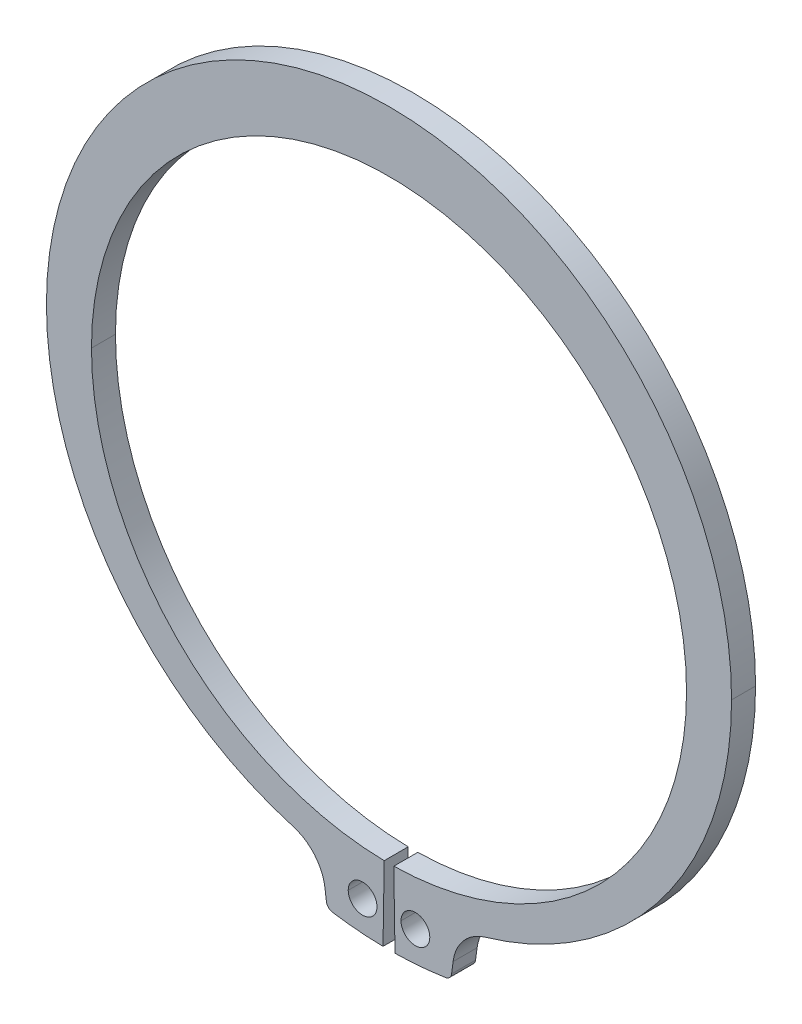
ISO-10303-21;
HEADER;
FILE_DESCRIPTION(('STEP AP214'),'2;1');
FILE_NAME('part.step','',(''),(''),'','','');
FILE_SCHEMA(('AUTOMOTIVE_DESIGN { 1 0 10303 214 1 1 1 1 }'));
ENDSEC;
DATA;
#1=APPLICATION_CONTEXT('core data for automotive mechanical design processes');
#2=APPLICATION_PROTOCOL_DEFINITION('international standard','automotive_design',2000,#1);
#3=PRODUCT_CONTEXT('',#1,'mechanical');
#4=PRODUCT('Part','Part','',(#3));
#5=PRODUCT_RELATED_PRODUCT_CATEGORY('part','',(#4));
#6=PRODUCT_DEFINITION_FORMATION('','',#4);
#7=PRODUCT_DEFINITION_CONTEXT('part definition',#1,'design');
#8=PRODUCT_DEFINITION('design','',#6,#7);
#9=PRODUCT_DEFINITION_SHAPE('','',#8);
#10=(LENGTH_UNIT() NAMED_UNIT(*) SI_UNIT(.MILLI.,.METRE.));
#11=(NAMED_UNIT(*) PLANE_ANGLE_UNIT() SI_UNIT($,.RADIAN.));
#12=(NAMED_UNIT(*) SI_UNIT($,.STERADIAN.) SOLID_ANGLE_UNIT());
#13=UNCERTAINTY_MEASURE_WITH_UNIT(LENGTH_MEASURE(1.E-05),#10,'distance_accuracy_value','');
#14=(GEOMETRIC_REPRESENTATION_CONTEXT(3) GLOBAL_UNCERTAINTY_ASSIGNED_CONTEXT((#13)) GLOBAL_UNIT_ASSIGNED_CONTEXT((#10,
#11,#12)) REPRESENTATION_CONTEXT('',''));
#15=CARTESIAN_POINT('',(0.,0.,0.));
#16=DIRECTION('',(0.,0.,1.));
#17=DIRECTION('',(1.,0.,0.));
#18=AXIS2_PLACEMENT_3D('',#15,#16,#17);
#19=CARTESIAN_POINT('',(-2.75,-35.5437758264369,-2.5));
#20=DIRECTION('',(0.,0.,1.));
#21=DIRECTION('',(1.,0.,0.));
#22=AXIS2_PLACEMENT_3D('',#19,#20,#21);
#23=CYLINDRICAL_SURFACE('',#22,1.5);
#24=DIRECTION('',(0.,0.,1.));
#25=VECTOR('',#24,1.);
#26=CARTESIAN_POINT('',(-4.25,-35.5437758264369,-2.5));
#27=LINE('',#26,#25);
#28=CARTESIAN_POINT('',(-4.25,-35.5437758264369,-2.5));
#29=VERTEX_POINT('',#28);
#30=CARTESIAN_POINT('',(-4.25,-35.5437758264369,0.));
#31=VERTEX_POINT('',#30);
#32=EDGE_CURVE('E211',#29,#31,#27,.T.);
#33=ORIENTED_EDGE('',*,*,#32,.F.);
#34=CARTESIAN_POINT('',(-2.75,-35.5437758264369,-2.5));
#35=DIRECTION('',(0.,0.,1.));
#36=DIRECTION('',(1.,0.,0.));
#37=AXIS2_PLACEMENT_3D('',#34,#35,#36);
#38=CIRCLE('',#37,1.5);
#39=CARTESIAN_POINT('',(-1.25,-35.5437758264369,-2.5));
#40=VERTEX_POINT('',#39);
#41=EDGE_CURVE('E206',#40,#29,#38,.T.);
#42=ORIENTED_EDGE('',*,*,#41,.F.);
#43=DIRECTION('',(0.,0.,1.));
#44=VECTOR('',#43,1.);
#45=CARTESIAN_POINT('',(-1.25,-35.5437758264369,-2.5));
#46=LINE('',#45,#44);
#47=CARTESIAN_POINT('',(-1.25,-35.5437758264369,0.));
#48=VERTEX_POINT('',#47);
#49=EDGE_CURVE('E208',#40,#48,#46,.T.);
#50=ORIENTED_EDGE('',*,*,#49,.T.);
#51=CARTESIAN_POINT('',(-2.75,-35.5437758264369,0.));
#52=DIRECTION('',(0.,0.,1.));
#53=DIRECTION('',(1.,0.,0.));
#54=AXIS2_PLACEMENT_3D('',#51,#52,#53);
#55=CIRCLE('',#54,1.5);
#56=EDGE_CURVE('E26',#48,#31,#55,.T.);
#57=ORIENTED_EDGE('',*,*,#56,.T.);
#58=EDGE_LOOP('',(#33,#42,#50,#57));
#59=FACE_BOUND('',#58,.T.);
#60=ADVANCED_FACE('F16',(#59),#23,.F.);
#61=CARTESIAN_POINT('',(2.75,-35.5437758264369,-2.5));
#62=DIRECTION('',(0.,0.,1.));
#63=DIRECTION('',(1.,0.,0.));
#64=AXIS2_PLACEMENT_3D('',#61,#62,#63);
#65=CYLINDRICAL_SURFACE('',#64,1.5);
#66=DIRECTION('',(0.,0.,1.));
#67=VECTOR('',#66,1.);
#68=CARTESIAN_POINT('',(1.25,-35.5437758264369,-2.5));
#69=LINE('',#68,#67);
#70=CARTESIAN_POINT('',(1.25,-35.5437758264369,-2.5));
#71=VERTEX_POINT('',#70);
#72=CARTESIAN_POINT('',(1.25,-35.5437758264369,0.));
#73=VERTEX_POINT('',#72);
#74=EDGE_CURVE('E256',#71,#73,#69,.T.);
#75=ORIENTED_EDGE('',*,*,#74,.F.);
#76=CARTESIAN_POINT('',(2.75,-35.5437758264369,-2.5));
#77=DIRECTION('',(0.,0.,1.));
#78=DIRECTION('',(1.,0.,0.));
#79=AXIS2_PLACEMENT_3D('',#76,#77,#78);
#80=CIRCLE('',#79,1.5);
#81=CARTESIAN_POINT('',(4.25,-35.5437758264369,-2.5));
#82=VERTEX_POINT('',#81);
#83=EDGE_CURVE('E144',#82,#71,#80,.T.);
#84=ORIENTED_EDGE('',*,*,#83,.F.);
#85=DIRECTION('',(0.,0.,1.));
#86=VECTOR('',#85,1.);
#87=CARTESIAN_POINT('',(4.25,-35.5437758264369,-2.5));
#88=LINE('',#87,#86);
#89=CARTESIAN_POINT('',(4.25,-35.5437758264369,0.));
#90=VERTEX_POINT('',#89);
#91=EDGE_CURVE('E314',#82,#90,#88,.T.);
#92=ORIENTED_EDGE('',*,*,#91,.T.);
#93=CARTESIAN_POINT('',(2.75,-35.5437758264369,0.));
#94=DIRECTION('',(0.,0.,1.));
#95=DIRECTION('',(1.,0.,0.));
#96=AXIS2_PLACEMENT_3D('',#93,#94,#95);
#97=CIRCLE('',#96,1.5);
#98=EDGE_CURVE('E11',#90,#73,#97,.T.);
#99=ORIENTED_EDGE('',*,*,#98,.T.);
#100=EDGE_LOOP('',(#75,#84,#92,#99));
#101=FACE_BOUND('',#100,.T.);
#102=ADVANCED_FACE('F449',(#101),#65,.F.);
#103=CARTESIAN_POINT('',(0.,0.,0.));
#104=DIRECTION('',(0.,0.,1.));
#105=DIRECTION('',(1.,0.,0.));
#106=AXIS2_PLACEMENT_3D('',#103,#104,#105);
#107=PLANE('',#106);
#108=ORIENTED_EDGE('',*,*,#98,.F.);
#109=CARTESIAN_POINT('',(2.75,-35.5437758264369,0.));
#110=DIRECTION('',(0.,0.,1.));
#111=DIRECTION('',(1.,0.,0.));
#112=AXIS2_PLACEMENT_3D('',#109,#110,#111);
#113=CIRCLE('',#112,1.5);
#114=EDGE_CURVE('E260',#73,#90,#113,.T.);
#115=ORIENTED_EDGE('',*,*,#114,.F.);
#116=EDGE_LOOP('',(#108,#115));
#117=FACE_BOUND('',#116,.T.);
#118=ORIENTED_EDGE('',*,*,#56,.F.);
#119=CARTESIAN_POINT('',(-2.75,-35.5437758264369,0.));
#120=DIRECTION('',(0.,0.,1.));
#121=DIRECTION('',(1.,0.,0.));
#122=AXIS2_PLACEMENT_3D('',#119,#120,#121);
#123=CIRCLE('',#122,1.5);
#124=EDGE_CURVE('E220',#31,#48,#123,.T.);
#125=ORIENTED_EDGE('',*,*,#124,.F.);
#126=EDGE_LOOP('',(#118,#125));
#127=FACE_BOUND('',#126,.T.);
#128=CARTESIAN_POINT('',(0.,0.,0.));
#129=DIRECTION('',(0.,0.,-1.));
#130=DIRECTION('',(1.,0.,0.));
#131=AXIS2_PLACEMENT_3D('',#128,#129,#130);
#132=CIRCLE('',#131,31.);
#133=CARTESIAN_POINT('',(-0.499355670103093,-30.9959778667287,0.));
#134=VERTEX_POINT('',#133);
#135=CARTESIAN_POINT('',(-31.,0.,0.));
#136=VERTEX_POINT('',#135);
#137=EDGE_CURVE('E283',#134,#136,#132,.T.);
#138=ORIENTED_EDGE('',*,*,#137,.T.);
#139=CARTESIAN_POINT('',(0.,0.,0.));
#140=DIRECTION('',(0.,0.,-1.));
#141=DIRECTION('',(1.,0.,0.));
#142=AXIS2_PLACEMENT_3D('',#139,#140,#141);
#143=CIRCLE('',#142,31.);
#144=CARTESIAN_POINT('',(31.,0.,0.));
#145=VERTEX_POINT('',#144);
#146=EDGE_CURVE('E382',#136,#145,#143,.T.);
#147=ORIENTED_EDGE('',*,*,#146,.T.);
#148=CARTESIAN_POINT('',(0.,0.,0.));
#149=DIRECTION('',(0.,0.,-1.));
#150=DIRECTION('',(1.,0.,0.));
#151=AXIS2_PLACEMENT_3D('',#148,#149,#150);
#152=CIRCLE('',#151,31.);
#153=CARTESIAN_POINT('',(0.499355670103093,-30.9959778667287,0.));
#154=VERTEX_POINT('',#153);
#155=EDGE_CURVE('E363',#145,#154,#152,.T.);
#156=ORIENTED_EDGE('',*,*,#155,.T.);
#157=DIRECTION('',(0.0161082474226804,-0.999870253765442,0.));
#158=VECTOR('',#157,1.);
#159=CARTESIAN_POINT('',(0.499355670103093,-30.9959778667287,0.));
#160=LINE('',#159,#158);
#161=CARTESIAN_POINT('',(0.624999999999981,-38.7949658460992,0.));
#162=VERTEX_POINT('',#161);
#163=EDGE_CURVE('E255',#154,#162,#160,.T.);
#164=ORIENTED_EDGE('',*,*,#163,.T.);
#165=CARTESIAN_POINT('',(0.,0.,0.));
#166=DIRECTION('',(0.,0.,1.));
#167=DIRECTION('',(1.,0.,0.));
#168=AXIS2_PLACEMENT_3D('',#165,#166,#167);
#169=CIRCLE('',#168,38.8);
#170=CARTESIAN_POINT('',(5.89100573529871,-38.3501766805145,0.));
#171=VERTEX_POINT('',#170);
#172=EDGE_CURVE('E175',#162,#171,#169,.T.);
#173=ORIENTED_EDGE('',*,*,#172,.T.);
#174=CARTESIAN_POINT('',(5.77713320175556,-37.6088717189066,0.));
#175=DIRECTION('',(0.,0.,1.));
#176=DIRECTION('',(-1.,0.,0.));
#177=AXIS2_PLACEMENT_3D('',#174,#175,#176);
#178=CIRCLE('',#177,0.75);
#179=CARTESIAN_POINT('',(6.52071684778591,-37.7067663630717,0.));
#180=VERTEX_POINT('',#179);
#181=EDGE_CURVE('E306',#171,#180,#178,.T.);
#182=ORIENTED_EDGE('',*,*,#181,.T.);
#183=DIRECTION('',(0.130526192220053,0.99144486137381,0.));
#184=VECTOR('',#183,1.);
#185=CARTESIAN_POINT('',(6.67762104532292,-36.5149606593261,0.));
#186=LINE('',#185,#184);
#187=CARTESIAN_POINT('',(6.67762104532292,-36.5149606593261,0.));
#188=VERTEX_POINT('',#187);
#189=EDGE_CURVE('E251',#180,#188,#186,.T.);
#190=ORIENTED_EDGE('',*,*,#189,.T.);
#191=CARTESIAN_POINT('',(11.2874892011521,-37.1218613155897,0.));
#192=DIRECTION('',(0.,0.,-1.));
#193=DIRECTION('',(1.,0.,0.));
#194=AXIS2_PLACEMENT_3D('',#191,#192,#193);
#195=CIRCLE('',#194,4.64964652642558);
#196=CARTESIAN_POINT('',(9.98652210444357,-32.6579283597778,0.));
#197=VERTEX_POINT('',#196);
#198=EDGE_CURVE('E331',#188,#197,#195,.T.);
#199=ORIENTED_EDGE('',*,*,#198,.T.);
#200=CARTESIAN_POINT('',(0.,1.60824581845718,0.));
#201=DIRECTION('',(0.,0.,1.));
#202=DIRECTION('',(1.,0.,0.));
#203=AXIS2_PLACEMENT_3D('',#200,#201,#202);
#204=CIRCLE('',#203,35.6917541815428);
#205=CARTESIAN_POINT('',(35.6917541815428,1.60824581845718,0.));
#206=VERTEX_POINT('',#205);
#207=EDGE_CURVE('E292',#197,#206,#204,.T.);
#208=ORIENTED_EDGE('',*,*,#207,.T.);
#209=CARTESIAN_POINT('',(0.,1.60824581845718,0.));
#210=DIRECTION('',(0.,0.,1.));
#211=DIRECTION('',(1.,0.,0.));
#212=AXIS2_PLACEMENT_3D('',#209,#210,#211);
#213=CIRCLE('',#212,35.6917541815428);
#214=CARTESIAN_POINT('',(-35.6917541815428,1.60824581845719,0.));
#215=VERTEX_POINT('',#214);
#216=EDGE_CURVE('E241',#206,#215,#213,.T.);
#217=ORIENTED_EDGE('',*,*,#216,.T.);
#218=CARTESIAN_POINT('',(0.,1.60824581845718,0.));
#219=DIRECTION('',(0.,0.,1.));
#220=DIRECTION('',(1.,0.,0.));
#221=AXIS2_PLACEMENT_3D('',#218,#219,#220);
#222=CIRCLE('',#221,35.6917541815428);
#223=CARTESIAN_POINT('',(-9.98652210444356,-32.6579283597778,0.));
#224=VERTEX_POINT('',#223);
#225=EDGE_CURVE('E374',#215,#224,#222,.T.);
#226=ORIENTED_EDGE('',*,*,#225,.T.);
#227=CARTESIAN_POINT('',(-11.2874892011521,-37.1218613155897,0.));
#228=DIRECTION('',(0.,0.,-1.));
#229=DIRECTION('',(1.,0.,0.));
#230=AXIS2_PLACEMENT_3D('',#227,#228,#229);
#231=CIRCLE('',#230,4.64964652642558);
#232=CARTESIAN_POINT('',(-6.67762104532292,-36.5149606593261,0.));
#233=VERTEX_POINT('',#232);
#234=EDGE_CURVE('E269',#224,#233,#231,.T.);
#235=ORIENTED_EDGE('',*,*,#234,.T.);
#236=DIRECTION('',(0.130526192220053,-0.99144486137381,0.));
#237=VECTOR('',#236,1.);
#238=CARTESIAN_POINT('',(-6.67762104532292,-36.5149606593261,0.));
#239=LINE('',#238,#237);
#240=CARTESIAN_POINT('',(-6.52071684778592,-37.7067663630717,0.));
#241=VERTEX_POINT('',#240);
#242=EDGE_CURVE('E246',#233,#241,#239,.T.);
#243=ORIENTED_EDGE('',*,*,#242,.T.);
#244=CARTESIAN_POINT('',(-5.77713320175556,-37.6088717189066,0.));
#245=DIRECTION('',(0.,0.,1.));
#246=DIRECTION('',(1.,0.,0.));
#247=AXIS2_PLACEMENT_3D('',#244,#245,#246);
#248=CIRCLE('',#247,0.75);
#249=CARTESIAN_POINT('',(-5.89100573529872,-38.3501766805145,0.));
#250=VERTEX_POINT('',#249);
#251=EDGE_CURVE('E360',#241,#250,#248,.T.);
#252=ORIENTED_EDGE('',*,*,#251,.T.);
#253=CARTESIAN_POINT('',(0.,0.,0.));
#254=DIRECTION('',(0.,0.,1.));
#255=DIRECTION('',(1.,0.,0.));
#256=AXIS2_PLACEMENT_3D('',#253,#254,#255);
#257=CIRCLE('',#256,38.8);
#258=CARTESIAN_POINT('',(-0.625,-38.7949658460992,0.));
#259=VERTEX_POINT('',#258);
#260=EDGE_CURVE('E289',#250,#259,#257,.T.);
#261=ORIENTED_EDGE('',*,*,#260,.T.);
#262=DIRECTION('',(0.0161082474226804,0.999870253765442,0.));
#263=VECTOR('',#262,1.);
#264=CARTESIAN_POINT('',(-0.499355670103093,-30.9959778667287,0.));
#265=LINE('',#264,#263);
#266=EDGE_CURVE('E328',#259,#134,#265,.T.);
#267=ORIENTED_EDGE('',*,*,#266,.T.);
#268=EDGE_LOOP('',(#138,#147,#156,#164,#173,#182,#190,#199,#208,#217,#226,#235,#243,#252,#261,#267));
#269=FACE_BOUND('',#268,.T.);
#270=ADVANCED_FACE('F428',(#117,#127,#269),#107,.T.);
#271=CARTESIAN_POINT('',(0.,0.,-2.5));
#272=DIRECTION('',(0.,0.,1.));
#273=DIRECTION('',(1.,0.,0.));
#274=AXIS2_PLACEMENT_3D('',#271,#272,#273);
#275=PLANE('',#274);
#276=ORIENTED_EDGE('',*,*,#83,.T.);
#277=CARTESIAN_POINT('',(2.75,-35.5437758264369,-2.5));
#278=DIRECTION('',(0.,0.,1.));
#279=DIRECTION('',(1.,0.,0.));
#280=AXIS2_PLACEMENT_3D('',#277,#278,#279);
#281=CIRCLE('',#280,1.5);
#282=EDGE_CURVE('E222',#71,#82,#281,.T.);
#283=ORIENTED_EDGE('',*,*,#282,.T.);
#284=EDGE_LOOP('',(#276,#283));
#285=FACE_BOUND('',#284,.T.);
#286=ORIENTED_EDGE('',*,*,#41,.T.);
#287=CARTESIAN_POINT('',(-2.75,-35.5437758264369,-2.5));
#288=DIRECTION('',(0.,0.,1.));
#289=DIRECTION('',(1.,0.,0.));
#290=AXIS2_PLACEMENT_3D('',#287,#288,#289);
#291=CIRCLE('',#290,1.5);
#292=EDGE_CURVE('E219',#29,#40,#291,.T.);
#293=ORIENTED_EDGE('',*,*,#292,.T.);
#294=EDGE_LOOP('',(#286,#293));
#295=FACE_BOUND('',#294,.T.);
#296=CARTESIAN_POINT('',(0.,0.,-2.5));
#297=DIRECTION('',(0.,0.,-1.));
#298=DIRECTION('',(1.,0.,0.));
#299=AXIS2_PLACEMENT_3D('',#296,#297,#298);
#300=CIRCLE('',#299,31.);
#301=CARTESIAN_POINT('',(-0.499355670103093,-30.9959778667287,-2.5));
#302=VERTEX_POINT('',#301);
#303=CARTESIAN_POINT('',(-31.,0.,-2.5));
#304=VERTEX_POINT('',#303);
#305=EDGE_CURVE('E299',#302,#304,#300,.T.);
#306=ORIENTED_EDGE('',*,*,#305,.F.);
#307=DIRECTION('',(0.0161082474226804,0.999870253765442,0.));
#308=VECTOR('',#307,1.);
#309=CARTESIAN_POINT('',(-0.499355670103093,-30.9959778667287,-2.5));
#310=LINE('',#309,#308);
#311=CARTESIAN_POINT('',(-0.625,-38.7949658460992,-2.5));
#312=VERTEX_POINT('',#311);
#313=EDGE_CURVE('E19',#312,#302,#310,.T.);
#314=ORIENTED_EDGE('',*,*,#313,.F.);
#315=CARTESIAN_POINT('',(0.,0.,-2.5));
#316=DIRECTION('',(0.,0.,1.));
#317=DIRECTION('',(1.,0.,0.));
#318=AXIS2_PLACEMENT_3D('',#315,#316,#317);
#319=CIRCLE('',#318,38.8);
#320=CARTESIAN_POINT('',(-5.89100573529872,-38.3501766805145,-2.5));
#321=VERTEX_POINT('',#320);
#322=EDGE_CURVE('E288',#321,#312,#319,.T.);
#323=ORIENTED_EDGE('',*,*,#322,.F.);
#324=CARTESIAN_POINT('',(-5.77713320175556,-37.6088717189066,-2.5));
#325=DIRECTION('',(0.,0.,1.));
#326=DIRECTION('',(1.,0.,0.));
#327=AXIS2_PLACEMENT_3D('',#324,#325,#326);
#328=CIRCLE('',#327,0.75);
#329=CARTESIAN_POINT('',(-6.52071684778592,-37.7067663630717,-2.5));
#330=VERTEX_POINT('',#329);
#331=EDGE_CURVE('E243',#330,#321,#328,.T.);
#332=ORIENTED_EDGE('',*,*,#331,.F.);
#333=DIRECTION('',(0.130526192220053,-0.99144486137381,0.));
#334=VECTOR('',#333,1.);
#335=CARTESIAN_POINT('',(-6.67762104532292,-36.5149606593261,-2.5));
#336=LINE('',#335,#334);
#337=CARTESIAN_POINT('',(-6.67762104532292,-36.5149606593261,-2.5));
#338=VERTEX_POINT('',#337);
#339=EDGE_CURVE('E266',#338,#330,#336,.T.);
#340=ORIENTED_EDGE('',*,*,#339,.F.);
#341=CARTESIAN_POINT('',(-11.2874892011521,-37.1218613155897,-2.5));
#342=DIRECTION('',(0.,0.,-1.));
#343=DIRECTION('',(1.,0.,0.));
#344=AXIS2_PLACEMENT_3D('',#341,#342,#343);
#345=CIRCLE('',#344,4.64964652642558);
#346=CARTESIAN_POINT('',(-9.98652210444356,-32.6579283597778,-2.5));
#347=VERTEX_POINT('',#346);
#348=EDGE_CURVE('E270',#347,#338,#345,.T.);
#349=ORIENTED_EDGE('',*,*,#348,.F.);
#350=CARTESIAN_POINT('',(0.,1.60824581845718,-2.5));
#351=DIRECTION('',(0.,0.,1.));
#352=DIRECTION('',(1.,0.,0.));
#353=AXIS2_PLACEMENT_3D('',#350,#351,#352);
#354=CIRCLE('',#353,35.6917541815428);
#355=CARTESIAN_POINT('',(-35.6917541815428,1.60824581845719,-2.5));
#356=VERTEX_POINT('',#355);
#357=EDGE_CURVE('E273',#356,#347,#354,.T.);
#358=ORIENTED_EDGE('',*,*,#357,.F.);
#359=CARTESIAN_POINT('',(0.,1.60824581845718,-2.5));
#360=DIRECTION('',(0.,0.,1.));
#361=DIRECTION('',(1.,0.,0.));
#362=AXIS2_PLACEMENT_3D('',#359,#360,#361);
#363=CIRCLE('',#362,35.6917541815428);
#364=CARTESIAN_POINT('',(35.6917541815428,1.60824581845718,-2.5));
#365=VERTEX_POINT('',#364);
#366=EDGE_CURVE('E242',#365,#356,#363,.T.);
#367=ORIENTED_EDGE('',*,*,#366,.F.);
#368=CARTESIAN_POINT('',(0.,1.60824581845718,-2.5));
#369=DIRECTION('',(0.,0.,1.));
#370=DIRECTION('',(1.,0.,0.));
#371=AXIS2_PLACEMENT_3D('',#368,#369,#370);
#372=CIRCLE('',#371,35.6917541815428);
#373=CARTESIAN_POINT('',(9.98652210444357,-32.6579283597778,-2.5));
#374=VERTEX_POINT('',#373);
#375=EDGE_CURVE('E290',#374,#365,#372,.T.);
#376=ORIENTED_EDGE('',*,*,#375,.F.);
#377=CARTESIAN_POINT('',(11.2874892011521,-37.1218613155897,-2.5));
#378=DIRECTION('',(0.,0.,-1.));
#379=DIRECTION('',(1.,0.,0.));
#380=AXIS2_PLACEMENT_3D('',#377,#378,#379);
#381=CIRCLE('',#380,4.64964652642558);
#382=CARTESIAN_POINT('',(6.67762104532292,-36.5149606593261,-2.5));
#383=VERTEX_POINT('',#382);
#384=EDGE_CURVE('E248',#383,#374,#381,.T.);
#385=ORIENTED_EDGE('',*,*,#384,.F.);
#386=DIRECTION('',(0.130526192220053,0.99144486137381,0.));
#387=VECTOR('',#386,1.);
#388=CARTESIAN_POINT('',(6.67762104532292,-36.5149606593261,-2.5));
#389=LINE('',#388,#387);
#390=CARTESIAN_POINT('',(6.52071684778591,-37.7067663630717,-2.5));
#391=VERTEX_POINT('',#390);
#392=EDGE_CURVE('E309',#391,#383,#389,.T.);
#393=ORIENTED_EDGE('',*,*,#392,.F.);
#394=CARTESIAN_POINT('',(5.77713320175556,-37.6088717189066,-2.5));
#395=DIRECTION('',(0.,0.,1.));
#396=DIRECTION('',(-1.,0.,0.));
#397=AXIS2_PLACEMENT_3D('',#394,#395,#396);
#398=CIRCLE('',#397,0.75);
#399=CARTESIAN_POINT('',(5.89100573529871,-38.3501766805145,-2.5));
#400=VERTEX_POINT('',#399);
#401=EDGE_CURVE('E187',#400,#391,#398,.T.);
#402=ORIENTED_EDGE('',*,*,#401,.F.);
#403=CARTESIAN_POINT('',(0.,0.,-2.5));
#404=DIRECTION('',(0.,0.,1.));
#405=DIRECTION('',(1.,0.,0.));
#406=AXIS2_PLACEMENT_3D('',#403,#404,#405);
#407=CIRCLE('',#406,38.8);
#408=CARTESIAN_POINT('',(0.624999999999981,-38.7949658460992,-2.5));
#409=VERTEX_POINT('',#408);
#410=EDGE_CURVE('E277',#409,#400,#407,.T.);
#411=ORIENTED_EDGE('',*,*,#410,.F.);
#412=DIRECTION('',(0.0161082474226804,-0.999870253765442,0.));
#413=VECTOR('',#412,1.);
#414=CARTESIAN_POINT('',(0.499355670103093,-30.9959778667287,-2.5));
#415=LINE('',#414,#413);
#416=CARTESIAN_POINT('',(0.499355670103093,-30.9959778667287,-2.5));
#417=VERTEX_POINT('',#416);
#418=EDGE_CURVE('E41',#417,#409,#415,.T.);
#419=ORIENTED_EDGE('',*,*,#418,.F.);
#420=CARTESIAN_POINT('',(0.,0.,-2.5));
#421=DIRECTION('',(0.,0.,-1.));
#422=DIRECTION('',(1.,0.,0.));
#423=AXIS2_PLACEMENT_3D('',#420,#421,#422);
#424=CIRCLE('',#423,31.);
#425=CARTESIAN_POINT('',(31.,0.,-2.5));
#426=VERTEX_POINT('',#425);
#427=EDGE_CURVE('E389',#426,#417,#424,.T.);
#428=ORIENTED_EDGE('',*,*,#427,.F.);
#429=CARTESIAN_POINT('',(0.,0.,-2.5));
#430=DIRECTION('',(0.,0.,-1.));
#431=DIRECTION('',(1.,0.,0.));
#432=AXIS2_PLACEMENT_3D('',#429,#430,#431);
#433=CIRCLE('',#432,31.);
#434=EDGE_CURVE('E282',#304,#426,#433,.T.);
#435=ORIENTED_EDGE('',*,*,#434,.F.);
#436=EDGE_LOOP('',(#306,#314,#323,#332,#340,#349,#358,#367,#376,#385,#393,#402,#411,#419,#428,#435));
#437=FACE_BOUND('',#436,.T.);
#438=ADVANCED_FACE('F224',(#285,#295,#437),#275,.F.);
#439=CARTESIAN_POINT('',(0.499355670103093,-30.9959778667287,-2.5));
#440=DIRECTION('',(-0.999870253765442,-0.0161082474226804,0.));
#441=DIRECTION('',(-0.0161082474226804,0.999870253765442,0.));
#442=AXIS2_PLACEMENT_3D('',#439,#440,#441);
#443=PLANE('',#442);
#444=ORIENTED_EDGE('',*,*,#163,.F.);
#445=DIRECTION('',(0.,0.,1.));
#446=VECTOR('',#445,1.);
#447=CARTESIAN_POINT('',(0.499355670103093,-30.9959778667287,-2.5));
#448=LINE('',#447,#446);
#449=EDGE_CURVE('E395',#417,#154,#448,.T.);
#450=ORIENTED_EDGE('',*,*,#449,.F.);
#451=ORIENTED_EDGE('',*,*,#418,.T.);
#452=DIRECTION('',(0.,0.,1.));
#453=VECTOR('',#452,1.);
#454=CARTESIAN_POINT('',(0.624999999999981,-38.7949658460992,-2.5));
#455=LINE('',#454,#453);
#456=EDGE_CURVE('E337',#409,#162,#455,.T.);
#457=ORIENTED_EDGE('',*,*,#456,.T.);
#458=EDGE_LOOP('',(#444,#450,#451,#457));
#459=FACE_BOUND('',#458,.T.);
#460=ADVANCED_FACE('F432',(#459),#443,.T.);
#461=CARTESIAN_POINT('',(0.,0.,-2.5));
#462=DIRECTION('',(0.,0.,1.));
#463=DIRECTION('',(1.,0.,0.));
#464=AXIS2_PLACEMENT_3D('',#461,#462,#463);
#465=CYLINDRICAL_SURFACE('',#464,38.8);
#466=ORIENTED_EDGE('',*,*,#172,.F.);
#467=ORIENTED_EDGE('',*,*,#456,.F.);
#468=ORIENTED_EDGE('',*,*,#410,.T.);
#469=DIRECTION('',(0.,0.,1.));
#470=VECTOR('',#469,1.);
#471=CARTESIAN_POINT('',(5.89100573529871,-38.3501766805145,-2.5));
#472=LINE('',#471,#470);
#473=EDGE_CURVE('E308',#400,#171,#472,.T.);
#474=ORIENTED_EDGE('',*,*,#473,.T.);
#475=EDGE_LOOP('',(#466,#467,#468,#474));
#476=FACE_BOUND('',#475,.T.);
#477=ADVANCED_FACE('F435',(#476),#465,.T.);
#478=CARTESIAN_POINT('',(5.77713320175556,-37.6088717189066,-2.5));
#479=DIRECTION('',(0.,0.,1.));
#480=DIRECTION('',(1.,0.,0.));
#481=AXIS2_PLACEMENT_3D('',#478,#479,#480);
#482=CYLINDRICAL_SURFACE('',#481,0.75);
#483=ORIENTED_EDGE('',*,*,#181,.F.);
#484=ORIENTED_EDGE('',*,*,#473,.F.);
#485=ORIENTED_EDGE('',*,*,#401,.T.);
#486=DIRECTION('',(0.,0.,1.));
#487=VECTOR('',#486,1.);
#488=CARTESIAN_POINT('',(6.52071684778591,-37.7067663630717,-2.5));
#489=LINE('',#488,#487);
#490=EDGE_CURVE('E235',#391,#180,#489,.T.);
#491=ORIENTED_EDGE('',*,*,#490,.T.);
#492=EDGE_LOOP('',(#483,#484,#485,#491));
#493=FACE_BOUND('',#492,.T.);
#494=ADVANCED_FACE('F437',(#493),#482,.T.);
#495=CARTESIAN_POINT('',(6.67762104532292,-36.5149606593261,-2.5));
#496=DIRECTION('',(0.99144486137381,-0.130526192220053,0.));
#497=DIRECTION('',(0.,0.,-1.));
#498=AXIS2_PLACEMENT_3D('',#495,#496,#497);
#499=PLANE('',#498);
#500=ORIENTED_EDGE('',*,*,#189,.F.);
#501=ORIENTED_EDGE('',*,*,#490,.F.);
#502=ORIENTED_EDGE('',*,*,#392,.T.);
#503=DIRECTION('',(0.,0.,1.));
#504=VECTOR('',#503,1.);
#505=CARTESIAN_POINT('',(6.67762104532292,-36.5149606593261,-2.5));
#506=LINE('',#505,#504);
#507=EDGE_CURVE('E252',#383,#188,#506,.T.);
#508=ORIENTED_EDGE('',*,*,#507,.T.);
#509=EDGE_LOOP('',(#500,#501,#502,#508));
#510=FACE_BOUND('',#509,.T.);
#511=ADVANCED_FACE('F444',(#510),#499,.T.);
#512=CARTESIAN_POINT('',(11.2874892011521,-37.1218613155897,-2.5));
#513=DIRECTION('',(0.,0.,1.));
#514=DIRECTION('',(1.,0.,0.));
#515=AXIS2_PLACEMENT_3D('',#512,#513,#514);
#516=CYLINDRICAL_SURFACE('',#515,4.64964652642558);
#517=ORIENTED_EDGE('',*,*,#198,.F.);
#518=ORIENTED_EDGE('',*,*,#507,.F.);
#519=ORIENTED_EDGE('',*,*,#384,.T.);
#520=DIRECTION('',(0.,0.,1.));
#521=VECTOR('',#520,1.);
#522=CARTESIAN_POINT('',(9.98652210444357,-32.6579283597778,-2.5));
#523=LINE('',#522,#521);
#524=EDGE_CURVE('E295',#374,#197,#523,.T.);
#525=ORIENTED_EDGE('',*,*,#524,.T.);
#526=EDGE_LOOP('',(#517,#518,#519,#525));
#527=FACE_BOUND('',#526,.T.);
#528=ADVANCED_FACE('F487',(#527),#516,.F.);
#529=CARTESIAN_POINT('',(0.,1.60824581845718,-2.5));
#530=DIRECTION('',(0.,0.,1.));
#531=DIRECTION('',(1.,0.,0.));
#532=AXIS2_PLACEMENT_3D('',#529,#530,#531);
#533=CYLINDRICAL_SURFACE('',#532,35.6917541815428);
#534=DIRECTION('',(0.,0.,1.));
#535=VECTOR('',#534,1.);
#536=CARTESIAN_POINT('',(-35.6917541815428,1.60824581845719,-2.5));
#537=LINE('',#536,#535);
#538=EDGE_CURVE('E237',#356,#215,#537,.T.);
#539=ORIENTED_EDGE('',*,*,#538,.F.);
#540=ORIENTED_EDGE('',*,*,#357,.T.);
#541=DIRECTION('',(0.,0.,1.));
#542=VECTOR('',#541,1.);
#543=CARTESIAN_POINT('',(-9.98652210444356,-32.6579283597778,-2.5));
#544=LINE('',#543,#542);
#545=EDGE_CURVE('E274',#347,#224,#544,.T.);
#546=ORIENTED_EDGE('',*,*,#545,.T.);
#547=ORIENTED_EDGE('',*,*,#225,.F.);
#548=EDGE_LOOP('',(#539,#540,#546,#547));
#549=FACE_BOUND('',#548,.T.);
#550=ADVANCED_FACE('F480',(#549),#533,.T.);
#551=CARTESIAN_POINT('',(-11.2874892011521,-37.1218613155897,-2.5));
#552=DIRECTION('',(0.,0.,1.));
#553=DIRECTION('',(1.,0.,0.));
#554=AXIS2_PLACEMENT_3D('',#551,#552,#553);
#555=CYLINDRICAL_SURFACE('',#554,4.64964652642558);
#556=ORIENTED_EDGE('',*,*,#234,.F.);
#557=ORIENTED_EDGE('',*,*,#545,.F.);
#558=ORIENTED_EDGE('',*,*,#348,.T.);
#559=DIRECTION('',(0.,0.,1.));
#560=VECTOR('',#559,1.);
#561=CARTESIAN_POINT('',(-6.67762104532292,-36.5149606593261,-2.5));
#562=LINE('',#561,#560);
#563=EDGE_CURVE('E265',#338,#233,#562,.T.);
#564=ORIENTED_EDGE('',*,*,#563,.T.);
#565=EDGE_LOOP('',(#556,#557,#558,#564));
#566=FACE_BOUND('',#565,.T.);
#567=ADVANCED_FACE('F477',(#566),#555,.F.);
#568=CARTESIAN_POINT('',(-6.67762104532292,-36.5149606593261,-2.5));
#569=DIRECTION('',(-0.99144486137381,-0.130526192220053,0.));
#570=DIRECTION('',(-0.130526192220053,0.99144486137381,0.));
#571=AXIS2_PLACEMENT_3D('',#568,#569,#570);
#572=PLANE('',#571);
#573=ORIENTED_EDGE('',*,*,#242,.F.);
#574=ORIENTED_EDGE('',*,*,#563,.F.);
#575=ORIENTED_EDGE('',*,*,#339,.T.);
#576=DIRECTION('',(0.,0.,1.));
#577=VECTOR('',#576,1.);
#578=CARTESIAN_POINT('',(-6.52071684778592,-37.7067663630717,-2.5));
#579=LINE('',#578,#577);
#580=EDGE_CURVE('E247',#330,#241,#579,.T.);
#581=ORIENTED_EDGE('',*,*,#580,.T.);
#582=EDGE_LOOP('',(#573,#574,#575,#581));
#583=FACE_BOUND('',#582,.T.);
#584=ADVANCED_FACE('F467',(#583),#572,.T.);
#585=CARTESIAN_POINT('',(-5.77713320175556,-37.6088717189066,-2.5));
#586=DIRECTION('',(0.,0.,1.));
#587=DIRECTION('',(1.,0.,0.));
#588=AXIS2_PLACEMENT_3D('',#585,#586,#587);
#589=CYLINDRICAL_SURFACE('',#588,0.75);
#590=ORIENTED_EDGE('',*,*,#251,.F.);
#591=ORIENTED_EDGE('',*,*,#580,.F.);
#592=ORIENTED_EDGE('',*,*,#331,.T.);
#593=DIRECTION('',(0.,0.,1.));
#594=VECTOR('',#593,1.);
#595=CARTESIAN_POINT('',(-5.89100573529872,-38.3501766805145,-2.5));
#596=LINE('',#595,#594);
#597=EDGE_CURVE('E284',#321,#250,#596,.T.);
#598=ORIENTED_EDGE('',*,*,#597,.T.);
#599=EDGE_LOOP('',(#590,#591,#592,#598));
#600=FACE_BOUND('',#599,.T.);
#601=ADVANCED_FACE('F463',(#600),#589,.T.);
#602=CARTESIAN_POINT('',(0.,0.,-2.5));
#603=DIRECTION('',(0.,0.,1.));
#604=DIRECTION('',(1.,0.,0.));
#605=AXIS2_PLACEMENT_3D('',#602,#603,#604);
#606=CYLINDRICAL_SURFACE('',#605,38.8);
#607=ORIENTED_EDGE('',*,*,#260,.F.);
#608=ORIENTED_EDGE('',*,*,#597,.F.);
#609=ORIENTED_EDGE('',*,*,#322,.T.);
#610=DIRECTION('',(0.,0.,1.));
#611=VECTOR('',#610,1.);
#612=CARTESIAN_POINT('',(-0.625,-38.7949658460992,-2.5));
#613=LINE('',#612,#611);
#614=EDGE_CURVE('E324',#312,#259,#613,.T.);
#615=ORIENTED_EDGE('',*,*,#614,.T.);
#616=EDGE_LOOP('',(#607,#608,#609,#615));
#617=FACE_BOUND('',#616,.T.);
#618=ADVANCED_FACE('F466',(#617),#606,.T.);
#619=CARTESIAN_POINT('',(-0.499355670103093,-30.9959778667287,-2.5));
#620=DIRECTION('',(0.999870253765442,-0.0161082474226804,0.));
#621=DIRECTION('',(0.,0.,-1.));
#622=AXIS2_PLACEMENT_3D('',#619,#620,#621);
#623=PLANE('',#622);
#624=ORIENTED_EDGE('',*,*,#266,.F.);
#625=ORIENTED_EDGE('',*,*,#614,.F.);
#626=ORIENTED_EDGE('',*,*,#313,.T.);
#627=DIRECTION('',(0.,0.,1.));
#628=VECTOR('',#627,1.);
#629=CARTESIAN_POINT('',(-0.499355670103093,-30.9959778667287,-2.5));
#630=LINE('',#629,#628);
#631=EDGE_CURVE('E278',#302,#134,#630,.T.);
#632=ORIENTED_EDGE('',*,*,#631,.T.);
#633=EDGE_LOOP('',(#624,#625,#626,#632));
#634=FACE_BOUND('',#633,.T.);
#635=ADVANCED_FACE('F483',(#634),#623,.T.);
#636=CARTESIAN_POINT('',(0.,0.,-2.5));
#637=DIRECTION('',(0.,0.,1.));
#638=DIRECTION('',(1.,0.,0.));
#639=AXIS2_PLACEMENT_3D('',#636,#637,#638);
#640=CYLINDRICAL_SURFACE('',#639,31.);
#641=DIRECTION('',(0.,0.,1.));
#642=VECTOR('',#641,1.);
#643=CARTESIAN_POINT('',(31.,0.,-2.5));
#644=LINE('',#643,#642);
#645=EDGE_CURVE('E350',#426,#145,#644,.T.);
#646=ORIENTED_EDGE('',*,*,#645,.F.);
#647=ORIENTED_EDGE('',*,*,#427,.T.);
#648=ORIENTED_EDGE('',*,*,#449,.T.);
#649=ORIENTED_EDGE('',*,*,#155,.F.);
#650=EDGE_LOOP('',(#646,#647,#648,#649));
#651=FACE_BOUND('',#650,.T.);
#652=ADVANCED_FACE('F430',(#651),#640,.F.);
#653=CARTESIAN_POINT('',(0.,0.,-2.5));
#654=DIRECTION('',(0.,0.,1.));
#655=DIRECTION('',(1.,0.,0.));
#656=AXIS2_PLACEMENT_3D('',#653,#654,#655);
#657=CYLINDRICAL_SURFACE('',#656,31.);
#658=DIRECTION('',(0.,0.,1.));
#659=VECTOR('',#658,1.);
#660=CARTESIAN_POINT('',(-31.,0.,-2.5));
#661=LINE('',#660,#659);
#662=EDGE_CURVE('E323',#304,#136,#661,.T.);
#663=ORIENTED_EDGE('',*,*,#662,.F.);
#664=ORIENTED_EDGE('',*,*,#434,.T.);
#665=ORIENTED_EDGE('',*,*,#645,.T.);
#666=ORIENTED_EDGE('',*,*,#146,.F.);
#667=EDGE_LOOP('',(#663,#664,#665,#666));
#668=FACE_BOUND('',#667,.T.);
#669=ADVANCED_FACE('F532',(#668),#657,.F.);
#670=CARTESIAN_POINT('',(0.,0.,-2.5));
#671=DIRECTION('',(0.,0.,1.));
#672=DIRECTION('',(1.,0.,0.));
#673=AXIS2_PLACEMENT_3D('',#670,#671,#672);
#674=CYLINDRICAL_SURFACE('',#673,31.);
#675=ORIENTED_EDGE('',*,*,#305,.T.);
#676=ORIENTED_EDGE('',*,*,#662,.T.);
#677=ORIENTED_EDGE('',*,*,#137,.F.);
#678=ORIENTED_EDGE('',*,*,#631,.F.);
#679=EDGE_LOOP('',(#675,#676,#677,#678));
#680=FACE_BOUND('',#679,.T.);
#681=ADVANCED_FACE('F461',(#680),#674,.F.);
#682=CARTESIAN_POINT('',(0.,1.60824581845718,-2.5));
#683=DIRECTION('',(0.,0.,1.));
#684=DIRECTION('',(1.,0.,0.));
#685=AXIS2_PLACEMENT_3D('',#682,#683,#684);
#686=CYLINDRICAL_SURFACE('',#685,35.6917541815428);
#687=ORIENTED_EDGE('',*,*,#375,.T.);
#688=DIRECTION('',(0.,0.,1.));
#689=VECTOR('',#688,1.);
#690=CARTESIAN_POINT('',(35.6917541815428,1.60824581845718,-2.5));
#691=LINE('',#690,#689);
#692=EDGE_CURVE('E293',#365,#206,#691,.T.);
#693=ORIENTED_EDGE('',*,*,#692,.T.);
#694=ORIENTED_EDGE('',*,*,#207,.F.);
#695=ORIENTED_EDGE('',*,*,#524,.F.);
#696=EDGE_LOOP('',(#687,#693,#694,#695));
#697=FACE_BOUND('',#696,.T.);
#698=ADVANCED_FACE('F473',(#697),#686,.T.);
#699=CARTESIAN_POINT('',(0.,1.60824581845718,-2.5));
#700=DIRECTION('',(0.,0.,1.));
#701=DIRECTION('',(1.,0.,0.));
#702=AXIS2_PLACEMENT_3D('',#699,#700,#701);
#703=CYLINDRICAL_SURFACE('',#702,35.6917541815428);
#704=ORIENTED_EDGE('',*,*,#366,.T.);
#705=ORIENTED_EDGE('',*,*,#538,.T.);
#706=ORIENTED_EDGE('',*,*,#216,.F.);
#707=ORIENTED_EDGE('',*,*,#692,.F.);
#708=EDGE_LOOP('',(#704,#705,#706,#707));
#709=FACE_BOUND('',#708,.T.);
#710=ADVANCED_FACE('F469',(#709),#703,.T.);
#711=CARTESIAN_POINT('',(2.75,-35.5437758264369,-2.5));
#712=DIRECTION('',(0.,0.,1.));
#713=DIRECTION('',(1.,0.,0.));
#714=AXIS2_PLACEMENT_3D('',#711,#712,#713);
#715=CYLINDRICAL_SURFACE('',#714,1.5);
#716=ORIENTED_EDGE('',*,*,#282,.F.);
#717=ORIENTED_EDGE('',*,*,#74,.T.);
#718=ORIENTED_EDGE('',*,*,#114,.T.);
#719=ORIENTED_EDGE('',*,*,#91,.F.);
#720=EDGE_LOOP('',(#716,#717,#718,#719));
#721=FACE_BOUND('',#720,.T.);
#722=ADVANCED_FACE('F472',(#721),#715,.F.);
#723=CARTESIAN_POINT('',(-2.75,-35.5437758264369,-2.5));
#724=DIRECTION('',(0.,0.,1.));
#725=DIRECTION('',(1.,0.,0.));
#726=AXIS2_PLACEMENT_3D('',#723,#724,#725);
#727=CYLINDRICAL_SURFACE('',#726,1.5);
#728=ORIENTED_EDGE('',*,*,#292,.F.);
#729=ORIENTED_EDGE('',*,*,#32,.T.);
#730=ORIENTED_EDGE('',*,*,#124,.T.);
#731=ORIENTED_EDGE('',*,*,#49,.F.);
#732=EDGE_LOOP('',(#728,#729,#730,#731));
#733=FACE_BOUND('',#732,.T.);
#734=ADVANCED_FACE('F218',(#733),#727,.F.);
#735=CLOSED_SHELL('',(#60,#102,#270,#438,#460,#477,#494,#511,#528,#550,#567,#584,#601,#618,#635,
#652,#669,#681,#698,#710,#722,#734));
#736=MANIFOLD_SOLID_BREP('B1',#735);
#737=ADVANCED_BREP_SHAPE_REPRESENTATION('',(#18,#736),#14);
#738=SHAPE_DEFINITION_REPRESENTATION(#9,#737);
ENDSEC;
END-ISO-10303-21;
